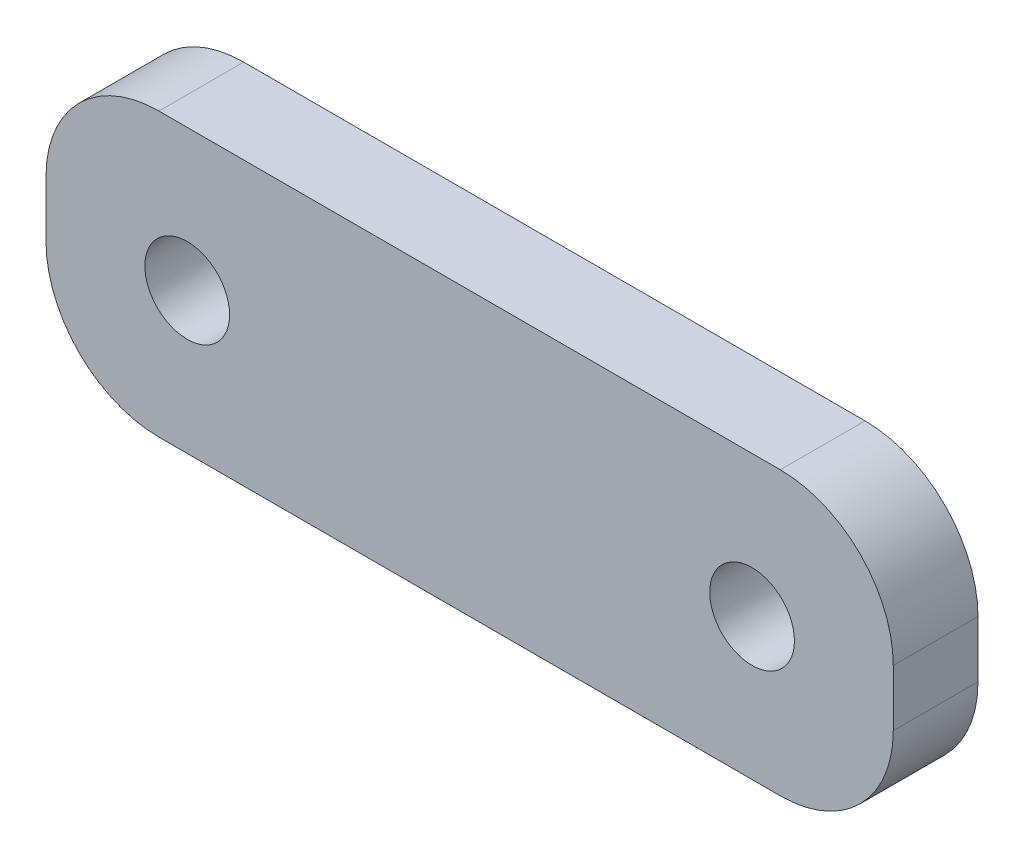
ISO-10303-21;
HEADER;
FILE_DESCRIPTION(('STEP AP214'),'2;1');
FILE_NAME('part.step','',(''),(''),'','','');
FILE_SCHEMA(('AUTOMOTIVE_DESIGN { 1 0 10303 214 1 1 1 1 }'));
ENDSEC;
DATA;
#1=APPLICATION_CONTEXT('core data for automotive mechanical design processes');
#2=APPLICATION_PROTOCOL_DEFINITION('international standard','automotive_design',2000,#1);
#3=PRODUCT_CONTEXT('',#1,'mechanical');
#4=PRODUCT('Part','Part','',(#3));
#5=PRODUCT_RELATED_PRODUCT_CATEGORY('part','',(#4));
#6=PRODUCT_DEFINITION_FORMATION('','',#4);
#7=PRODUCT_DEFINITION_CONTEXT('part definition',#1,'design');
#8=PRODUCT_DEFINITION('design','',#6,#7);
#9=PRODUCT_DEFINITION_SHAPE('','',#8);
#10=(LENGTH_UNIT() NAMED_UNIT(*) SI_UNIT(.MILLI.,.METRE.));
#11=(NAMED_UNIT(*) PLANE_ANGLE_UNIT() SI_UNIT($,.RADIAN.));
#12=(NAMED_UNIT(*) SI_UNIT($,.STERADIAN.) SOLID_ANGLE_UNIT());
#13=UNCERTAINTY_MEASURE_WITH_UNIT(LENGTH_MEASURE(1.E-05),#10,'distance_accuracy_value','');
#14=(GEOMETRIC_REPRESENTATION_CONTEXT(3) GLOBAL_UNCERTAINTY_ASSIGNED_CONTEXT((#13)) GLOBAL_UNIT_ASSIGNED_CONTEXT((#10,
#11,#12)) REPRESENTATION_CONTEXT('',''));
#15=CARTESIAN_POINT('',(0.,0.,0.));
#16=DIRECTION('',(0.,0.,1.));
#17=DIRECTION('',(1.,0.,0.));
#18=AXIS2_PLACEMENT_3D('',#15,#16,#17);
#19=CARTESIAN_POINT('',(-15.,5.,3.));
#20=DIRECTION('',(1.,0.,0.));
#21=DIRECTION('',(0.,1.,0.));
#22=AXIS2_PLACEMENT_3D('',#19,#20,#21);
#23=PLANE('',#22);
#24=DIRECTION('',(0.,-1.,0.));
#25=VECTOR('',#24,1.);
#26=CARTESIAN_POINT('',(-15.,5.,0.));
#27=LINE('',#26,#25);
#28=CARTESIAN_POINT('',(-15.,0.999999999999999,0.));
#29=VERTEX_POINT('',#28);
#30=CARTESIAN_POINT('',(-15.,-1.,0.));
#31=VERTEX_POINT('',#30);
#32=EDGE_CURVE('E138',#29,#31,#27,.T.);
#33=ORIENTED_EDGE('',*,*,#32,.T.);
#34=DIRECTION('',(0.,0.,-1.));
#35=VECTOR('',#34,1.);
#36=CARTESIAN_POINT('',(-15.,-1.,3.));
#37=LINE('',#36,#35);
#38=CARTESIAN_POINT('',(-15.,-1.,3.));
#39=VERTEX_POINT('',#38);
#40=EDGE_CURVE('E115',#31,#39,#37,.F.);
#41=ORIENTED_EDGE('',*,*,#40,.T.);
#42=DIRECTION('',(0.,-1.,0.));
#43=VECTOR('',#42,1.);
#44=CARTESIAN_POINT('',(-15.,5.,3.));
#45=LINE('',#44,#43);
#46=CARTESIAN_POINT('',(-15.,0.999999999999999,3.));
#47=VERTEX_POINT('',#46);
#48=EDGE_CURVE('E148',#47,#39,#45,.T.);
#49=ORIENTED_EDGE('',*,*,#48,.F.);
#50=DIRECTION('',(0.,0.,-1.));
#51=VECTOR('',#50,1.);
#52=CARTESIAN_POINT('',(-15.,0.999999999999999,3.));
#53=LINE('',#52,#51);
#54=EDGE_CURVE('E120',#47,#29,#53,.T.);
#55=ORIENTED_EDGE('',*,*,#54,.T.);
#56=EDGE_LOOP('',(#33,#41,#49,#55));
#57=FACE_BOUND('',#56,.T.);
#58=ADVANCED_FACE('F43',(#57),#23,.F.);
#59=CARTESIAN_POINT('',(-15.,-5.,3.));
#60=DIRECTION('',(0.,1.,0.));
#61=DIRECTION('',(0.,0.,1.));
#62=AXIS2_PLACEMENT_3D('',#59,#60,#61);
#63=PLANE('',#62);
#64=DIRECTION('',(1.,0.,0.));
#65=VECTOR('',#64,1.);
#66=CARTESIAN_POINT('',(-15.,-5.,3.));
#67=LINE('',#66,#65);
#68=CARTESIAN_POINT('',(-11.,-5.,3.));
#69=VERTEX_POINT('',#68);
#70=CARTESIAN_POINT('',(11.,-5.,3.));
#71=VERTEX_POINT('',#70);
#72=EDGE_CURVE('E130',#69,#71,#67,.T.);
#73=ORIENTED_EDGE('',*,*,#72,.F.);
#74=DIRECTION('',(0.,0.,-1.));
#75=VECTOR('',#74,1.);
#76=CARTESIAN_POINT('',(-11.,-5.,3.));
#77=LINE('',#76,#75);
#78=CARTESIAN_POINT('',(-11.,-5.,0.));
#79=VERTEX_POINT('',#78);
#80=EDGE_CURVE('E114',#69,#79,#77,.T.);
#81=ORIENTED_EDGE('',*,*,#80,.T.);
#82=DIRECTION('',(1.,0.,0.));
#83=VECTOR('',#82,1.);
#84=CARTESIAN_POINT('',(-15.,-5.,0.));
#85=LINE('',#84,#83);
#86=CARTESIAN_POINT('',(11.,-5.,0.));
#87=VERTEX_POINT('',#86);
#88=EDGE_CURVE('E127',#79,#87,#85,.T.);
#89=ORIENTED_EDGE('',*,*,#88,.T.);
#90=DIRECTION('',(0.,0.,-1.));
#91=VECTOR('',#90,1.);
#92=CARTESIAN_POINT('',(11.,-5.,3.));
#93=LINE('',#92,#91);
#94=EDGE_CURVE('E132',#87,#71,#93,.F.);
#95=ORIENTED_EDGE('',*,*,#94,.T.);
#96=EDGE_LOOP('',(#73,#81,#89,#95));
#97=FACE_BOUND('',#96,.T.);
#98=ADVANCED_FACE('F126',(#97),#63,.F.);
#99=CARTESIAN_POINT('',(15.,5.,3.));
#100=DIRECTION('',(-1.,0.,0.));
#101=DIRECTION('',(0.,-1.,0.));
#102=AXIS2_PLACEMENT_3D('',#99,#100,#101);
#103=PLANE('',#102);
#104=DIRECTION('',(0.,1.,0.));
#105=VECTOR('',#104,1.);
#106=CARTESIAN_POINT('',(15.,5.,3.));
#107=LINE('',#106,#105);
#108=CARTESIAN_POINT('',(15.,-0.999999999999999,3.));
#109=VERTEX_POINT('',#108);
#110=CARTESIAN_POINT('',(15.,1.,3.));
#111=VERTEX_POINT('',#110);
#112=EDGE_CURVE('E171',#109,#111,#107,.T.);
#113=ORIENTED_EDGE('',*,*,#112,.F.);
#114=DIRECTION('',(0.,0.,-1.));
#115=VECTOR('',#114,1.);
#116=CARTESIAN_POINT('',(15.,-0.999999999999999,3.));
#117=LINE('',#116,#115);
#118=CARTESIAN_POINT('',(15.,-0.999999999999999,0.));
#119=VERTEX_POINT('',#118);
#120=EDGE_CURVE('E11',#109,#119,#117,.T.);
#121=ORIENTED_EDGE('',*,*,#120,.T.);
#122=DIRECTION('',(0.,1.,0.));
#123=VECTOR('',#122,1.);
#124=CARTESIAN_POINT('',(15.,5.,0.));
#125=LINE('',#124,#123);
#126=CARTESIAN_POINT('',(15.,1.,0.));
#127=VERTEX_POINT('',#126);
#128=EDGE_CURVE('E137',#119,#127,#125,.T.);
#129=ORIENTED_EDGE('',*,*,#128,.T.);
#130=DIRECTION('',(0.,0.,-1.));
#131=VECTOR('',#130,1.);
#132=CARTESIAN_POINT('',(15.,1.,3.));
#133=LINE('',#132,#131);
#134=EDGE_CURVE('E51',#127,#111,#133,.F.);
#135=ORIENTED_EDGE('',*,*,#134,.T.);
#136=EDGE_LOOP('',(#113,#121,#129,#135));
#137=FACE_BOUND('',#136,.T.);
#138=ADVANCED_FACE('F170',(#137),#103,.F.);
#139=CARTESIAN_POINT('',(-15.,5.,3.));
#140=DIRECTION('',(0.,-1.,0.));
#141=DIRECTION('',(0.,0.,-1.));
#142=AXIS2_PLACEMENT_3D('',#139,#140,#141);
#143=PLANE('',#142);
#144=DIRECTION('',(-1.,0.,0.));
#145=VECTOR('',#144,1.);
#146=CARTESIAN_POINT('',(-15.,5.,0.));
#147=LINE('',#146,#145);
#148=CARTESIAN_POINT('',(11.,5.,0.));
#149=VERTEX_POINT('',#148);
#150=CARTESIAN_POINT('',(-11.,5.,0.));
#151=VERTEX_POINT('',#150);
#152=EDGE_CURVE('E141',#149,#151,#147,.T.);
#153=ORIENTED_EDGE('',*,*,#152,.T.);
#154=DIRECTION('',(0.,0.,-1.));
#155=VECTOR('',#154,1.);
#156=CARTESIAN_POINT('',(-11.,5.,3.));
#157=LINE('',#156,#155);
#158=CARTESIAN_POINT('',(-11.,5.,3.));
#159=VERTEX_POINT('',#158);
#160=EDGE_CURVE('E58',#151,#159,#157,.F.);
#161=ORIENTED_EDGE('',*,*,#160,.T.);
#162=DIRECTION('',(-1.,0.,0.));
#163=VECTOR('',#162,1.);
#164=CARTESIAN_POINT('',(-15.,5.,3.));
#165=LINE('',#164,#163);
#166=CARTESIAN_POINT('',(11.,5.,3.));
#167=VERTEX_POINT('',#166);
#168=EDGE_CURVE('E149',#167,#159,#165,.T.);
#169=ORIENTED_EDGE('',*,*,#168,.F.);
#170=DIRECTION('',(0.,0.,-1.));
#171=VECTOR('',#170,1.);
#172=CARTESIAN_POINT('',(11.,5.,3.));
#173=LINE('',#172,#171);
#174=EDGE_CURVE('E164',#167,#149,#173,.T.);
#175=ORIENTED_EDGE('',*,*,#174,.T.);
#176=EDGE_LOOP('',(#153,#161,#169,#175));
#177=FACE_BOUND('',#176,.T.);
#178=ADVANCED_FACE('F180',(#177),#143,.F.);
#179=CARTESIAN_POINT('',(0.,0.,3.));
#180=DIRECTION('',(0.,0.,1.));
#181=DIRECTION('',(1.,0.,0.));
#182=AXIS2_PLACEMENT_3D('',#179,#180,#181);
#183=PLANE('',#182);
#184=CARTESIAN_POINT('',(10.,0.,3.));
#185=DIRECTION('',(0.,0.,1.));
#186=DIRECTION('',(1.,0.,0.));
#187=AXIS2_PLACEMENT_3D('',#184,#185,#186);
#188=CIRCLE('',#187,1.5);
#189=CARTESIAN_POINT('',(11.5,0.,3.));
#190=VERTEX_POINT('',#189);
#191=EDGE_CURVE('E196',#190,#190,#188,.T.);
#192=ORIENTED_EDGE('',*,*,#191,.F.);
#193=EDGE_LOOP('',(#192));
#194=FACE_BOUND('',#193,.T.);
#195=CARTESIAN_POINT('',(-10.,0.,3.));
#196=DIRECTION('',(0.,0.,1.));
#197=DIRECTION('',(1.,0.,0.));
#198=AXIS2_PLACEMENT_3D('',#195,#196,#197);
#199=CIRCLE('',#198,1.5);
#200=CARTESIAN_POINT('',(-8.5,0.,3.));
#201=VERTEX_POINT('',#200);
#202=EDGE_CURVE('E193',#201,#201,#199,.T.);
#203=ORIENTED_EDGE('',*,*,#202,.F.);
#204=EDGE_LOOP('',(#203));
#205=FACE_BOUND('',#204,.T.);
#206=ORIENTED_EDGE('',*,*,#48,.T.);
#207=CARTESIAN_POINT('',(-11.,-1.,3.));
#208=DIRECTION('',(0.,0.,1.));
#209=DIRECTION('',(1.,0.,0.));
#210=AXIS2_PLACEMENT_3D('',#207,#208,#209);
#211=CIRCLE('',#210,4.);
#212=EDGE_CURVE('E162',#39,#69,#211,.T.);
#213=ORIENTED_EDGE('',*,*,#212,.T.);
#214=ORIENTED_EDGE('',*,*,#72,.T.);
#215=CARTESIAN_POINT('',(11.,-1.,3.));
#216=DIRECTION('',(0.,0.,1.));
#217=DIRECTION('',(1.,0.,0.));
#218=AXIS2_PLACEMENT_3D('',#215,#216,#217);
#219=CIRCLE('',#218,4.);
#220=EDGE_CURVE('E158',#71,#109,#219,.T.);
#221=ORIENTED_EDGE('',*,*,#220,.T.);
#222=ORIENTED_EDGE('',*,*,#112,.T.);
#223=CARTESIAN_POINT('',(11.,1.,3.));
#224=DIRECTION('',(0.,0.,1.));
#225=DIRECTION('',(1.,0.,0.));
#226=AXIS2_PLACEMENT_3D('',#223,#224,#225);
#227=CIRCLE('',#226,4.);
#228=EDGE_CURVE('E65',#111,#167,#227,.T.);
#229=ORIENTED_EDGE('',*,*,#228,.T.);
#230=ORIENTED_EDGE('',*,*,#168,.T.);
#231=CARTESIAN_POINT('',(-11.,1.,3.));
#232=DIRECTION('',(0.,0.,1.));
#233=DIRECTION('',(1.,0.,0.));
#234=AXIS2_PLACEMENT_3D('',#231,#232,#233);
#235=CIRCLE('',#234,4.);
#236=EDGE_CURVE('E160',#159,#47,#235,.T.);
#237=ORIENTED_EDGE('',*,*,#236,.T.);
#238=EDGE_LOOP('',(#206,#213,#214,#221,#222,#229,#230,#237));
#239=FACE_BOUND('',#238,.T.);
#240=ADVANCED_FACE('F175',(#194,#205,#239),#183,.T.);
#241=CARTESIAN_POINT('',(0.,0.,0.));
#242=DIRECTION('',(0.,0.,1.));
#243=DIRECTION('',(1.,0.,0.));
#244=AXIS2_PLACEMENT_3D('',#241,#242,#243);
#245=PLANE('',#244);
#246=CARTESIAN_POINT('',(10.,0.,0.));
#247=DIRECTION('',(0.,0.,1.));
#248=DIRECTION('',(1.,0.,0.));
#249=AXIS2_PLACEMENT_3D('',#246,#247,#248);
#250=CIRCLE('',#249,1.5);
#251=CARTESIAN_POINT('',(11.5,0.,0.));
#252=VERTEX_POINT('',#251);
#253=EDGE_CURVE('E143',#252,#252,#250,.T.);
#254=ORIENTED_EDGE('',*,*,#253,.T.);
#255=EDGE_LOOP('',(#254));
#256=FACE_BOUND('',#255,.T.);
#257=CARTESIAN_POINT('',(-10.,0.,0.));
#258=DIRECTION('',(0.,0.,1.));
#259=DIRECTION('',(1.,0.,0.));
#260=AXIS2_PLACEMENT_3D('',#257,#258,#259);
#261=CIRCLE('',#260,1.5);
#262=CARTESIAN_POINT('',(-8.5,0.,0.));
#263=VERTEX_POINT('',#262);
#264=EDGE_CURVE('E190',#263,#263,#261,.T.);
#265=ORIENTED_EDGE('',*,*,#264,.T.);
#266=EDGE_LOOP('',(#265));
#267=FACE_BOUND('',#266,.T.);
#268=ORIENTED_EDGE('',*,*,#88,.F.);
#269=CARTESIAN_POINT('',(-11.,-1.,0.));
#270=DIRECTION('',(0.,0.,1.));
#271=DIRECTION('',(1.,0.,0.));
#272=AXIS2_PLACEMENT_3D('',#269,#270,#271);
#273=CIRCLE('',#272,4.);
#274=EDGE_CURVE('E110',#79,#31,#273,.F.);
#275=ORIENTED_EDGE('',*,*,#274,.T.);
#276=ORIENTED_EDGE('',*,*,#32,.F.);
#277=CARTESIAN_POINT('',(-11.,1.,0.));
#278=DIRECTION('',(0.,0.,1.));
#279=DIRECTION('',(1.,0.,0.));
#280=AXIS2_PLACEMENT_3D('',#277,#278,#279);
#281=CIRCLE('',#280,4.);
#282=EDGE_CURVE('E121',#29,#151,#281,.F.);
#283=ORIENTED_EDGE('',*,*,#282,.T.);
#284=ORIENTED_EDGE('',*,*,#152,.F.);
#285=CARTESIAN_POINT('',(11.,1.,0.));
#286=DIRECTION('',(0.,0.,1.));
#287=DIRECTION('',(1.,0.,0.));
#288=AXIS2_PLACEMENT_3D('',#285,#286,#287);
#289=CIRCLE('',#288,4.);
#290=EDGE_CURVE('E131',#149,#127,#289,.F.);
#291=ORIENTED_EDGE('',*,*,#290,.T.);
#292=ORIENTED_EDGE('',*,*,#128,.F.);
#293=CARTESIAN_POINT('',(11.,-1.,0.));
#294=DIRECTION('',(0.,0.,1.));
#295=DIRECTION('',(1.,0.,0.));
#296=AXIS2_PLACEMENT_3D('',#293,#294,#295);
#297=CIRCLE('',#296,4.);
#298=EDGE_CURVE('E136',#119,#87,#297,.F.);
#299=ORIENTED_EDGE('',*,*,#298,.T.);
#300=EDGE_LOOP('',(#268,#275,#276,#283,#284,#291,#292,#299));
#301=FACE_BOUND('',#300,.T.);
#302=ADVANCED_FACE('F134',(#256,#267,#301),#245,.F.);
#303=CARTESIAN_POINT('',(-10.,0.,0.));
#304=DIRECTION('',(0.,0.,1.));
#305=DIRECTION('',(1.,0.,0.));
#306=AXIS2_PLACEMENT_3D('',#303,#304,#305);
#307=CYLINDRICAL_SURFACE('',#306,1.5);
#308=ORIENTED_EDGE('',*,*,#264,.F.);
#309=EDGE_LOOP('',(#308));
#310=FACE_BOUND('',#309,.T.);
#311=ORIENTED_EDGE('',*,*,#202,.T.);
#312=EDGE_LOOP('',(#311));
#313=FACE_BOUND('',#312,.T.);
#314=ADVANCED_FACE('F207',(#310,#313),#307,.F.);
#315=CARTESIAN_POINT('',(10.,0.,0.));
#316=DIRECTION('',(0.,0.,1.));
#317=DIRECTION('',(1.,0.,0.));
#318=AXIS2_PLACEMENT_3D('',#315,#316,#317);
#319=CYLINDRICAL_SURFACE('',#318,1.5);
#320=ORIENTED_EDGE('',*,*,#253,.F.);
#321=EDGE_LOOP('',(#320));
#322=FACE_BOUND('',#321,.T.);
#323=ORIENTED_EDGE('',*,*,#191,.T.);
#324=EDGE_LOOP('',(#323));
#325=FACE_BOUND('',#324,.T.);
#326=ADVANCED_FACE('F204',(#322,#325),#319,.F.);
#327=CARTESIAN_POINT('',(-11.,-1.,3.));
#328=DIRECTION('',(0.,0.,-1.));
#329=DIRECTION('',(-1.,0.,0.));
#330=AXIS2_PLACEMENT_3D('',#327,#328,#329);
#331=CYLINDRICAL_SURFACE('',#330,4.);
#332=ORIENTED_EDGE('',*,*,#212,.F.);
#333=ORIENTED_EDGE('',*,*,#40,.F.);
#334=ORIENTED_EDGE('',*,*,#274,.F.);
#335=ORIENTED_EDGE('',*,*,#80,.F.);
#336=EDGE_LOOP('',(#332,#333,#334,#335));
#337=FACE_BOUND('',#336,.T.);
#338=ADVANCED_FACE('F113',(#337),#331,.T.);
#339=CARTESIAN_POINT('',(-11.,1.,3.));
#340=DIRECTION('',(0.,0.,-1.));
#341=DIRECTION('',(-1.,0.,0.));
#342=AXIS2_PLACEMENT_3D('',#339,#340,#341);
#343=CYLINDRICAL_SURFACE('',#342,4.);
#344=ORIENTED_EDGE('',*,*,#236,.F.);
#345=ORIENTED_EDGE('',*,*,#160,.F.);
#346=ORIENTED_EDGE('',*,*,#282,.F.);
#347=ORIENTED_EDGE('',*,*,#54,.F.);
#348=EDGE_LOOP('',(#344,#345,#346,#347));
#349=FACE_BOUND('',#348,.T.);
#350=ADVANCED_FACE('F184',(#349),#343,.T.);
#351=CARTESIAN_POINT('',(11.,-1.,3.));
#352=DIRECTION('',(0.,0.,-1.));
#353=DIRECTION('',(-1.,0.,0.));
#354=AXIS2_PLACEMENT_3D('',#351,#352,#353);
#355=CYLINDRICAL_SURFACE('',#354,4.);
#356=ORIENTED_EDGE('',*,*,#220,.F.);
#357=ORIENTED_EDGE('',*,*,#94,.F.);
#358=ORIENTED_EDGE('',*,*,#298,.F.);
#359=ORIENTED_EDGE('',*,*,#120,.F.);
#360=EDGE_LOOP('',(#356,#357,#358,#359));
#361=FACE_BOUND('',#360,.T.);
#362=ADVANCED_FACE('F235',(#361),#355,.T.);
#363=CARTESIAN_POINT('',(11.,1.,3.));
#364=DIRECTION('',(0.,0.,-1.));
#365=DIRECTION('',(-1.,0.,0.));
#366=AXIS2_PLACEMENT_3D('',#363,#364,#365);
#367=CYLINDRICAL_SURFACE('',#366,4.);
#368=ORIENTED_EDGE('',*,*,#228,.F.);
#369=ORIENTED_EDGE('',*,*,#134,.F.);
#370=ORIENTED_EDGE('',*,*,#290,.F.);
#371=ORIENTED_EDGE('',*,*,#174,.F.);
#372=EDGE_LOOP('',(#368,#369,#370,#371));
#373=FACE_BOUND('',#372,.T.);
#374=ADVANCED_FACE('F45',(#373),#367,.T.);
#375=CLOSED_SHELL('',(#58,#98,#138,#178,#240,#302,#314,#326,#338,#350,#362,#374));
#376=MANIFOLD_SOLID_BREP('B2',#375);
#377=ADVANCED_BREP_SHAPE_REPRESENTATION('',(#18,#376),#14);
#378=SHAPE_DEFINITION_REPRESENTATION(#9,#377);
ENDSEC;
END-ISO-10303-21;
